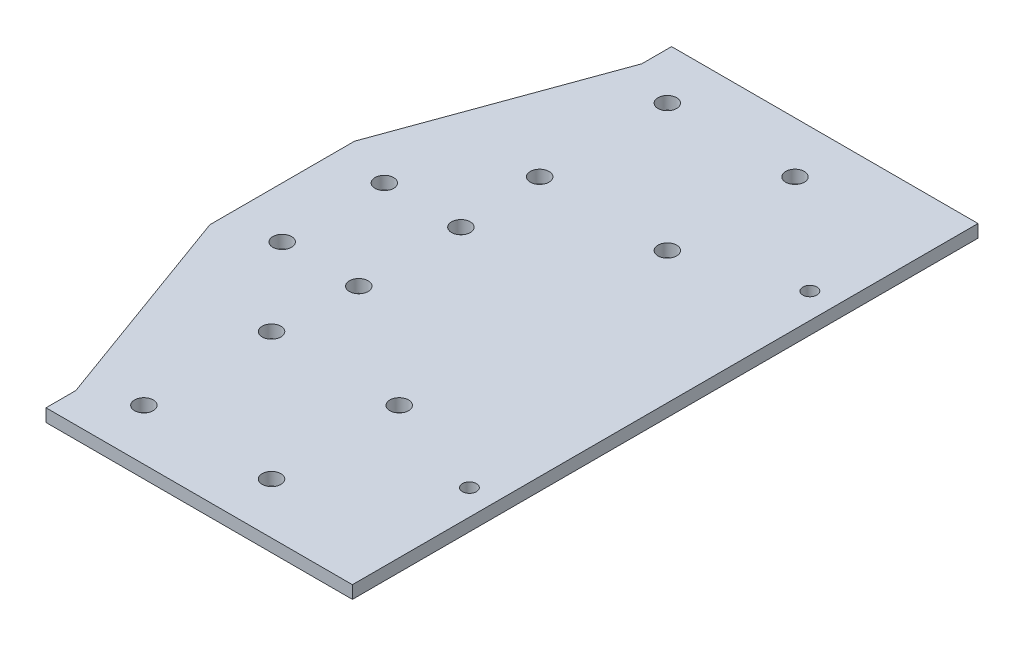
ISO-10303-21;
HEADER;
FILE_DESCRIPTION(('STEP AP214'),'2;1');
FILE_NAME('part.step','',(''),(''),'','','');
FILE_SCHEMA(('AUTOMOTIVE_DESIGN { 1 0 10303 214 1 1 1 1 }'));
ENDSEC;
DATA;
#1=APPLICATION_CONTEXT('core data for automotive mechanical design processes');
#2=APPLICATION_PROTOCOL_DEFINITION('international standard','automotive_design',2000,#1);
#3=PRODUCT_CONTEXT('',#1,'mechanical');
#4=PRODUCT('Part','Part','',(#3));
#5=PRODUCT_RELATED_PRODUCT_CATEGORY('part','',(#4));
#6=PRODUCT_DEFINITION_FORMATION('','',#4);
#7=PRODUCT_DEFINITION_CONTEXT('part definition',#1,'design');
#8=PRODUCT_DEFINITION('design','',#6,#7);
#9=PRODUCT_DEFINITION_SHAPE('','',#8);
#10=(LENGTH_UNIT() NAMED_UNIT(*) SI_UNIT(.MILLI.,.METRE.));
#11=(NAMED_UNIT(*) PLANE_ANGLE_UNIT() SI_UNIT($,.RADIAN.));
#12=(NAMED_UNIT(*) SI_UNIT($,.STERADIAN.) SOLID_ANGLE_UNIT());
#13=UNCERTAINTY_MEASURE_WITH_UNIT(LENGTH_MEASURE(1.E-05),#10,'distance_accuracy_value','');
#14=(GEOMETRIC_REPRESENTATION_CONTEXT(3) GLOBAL_UNCERTAINTY_ASSIGNED_CONTEXT((#13)) GLOBAL_UNIT_ASSIGNED_CONTEXT((#10,
#11,#12)) REPRESENTATION_CONTEXT('',''));
#15=CARTESIAN_POINT('',(0.,0.,0.));
#16=DIRECTION('',(0.,0.,1.));
#17=DIRECTION('',(1.,0.,0.));
#18=AXIS2_PLACEMENT_3D('',#15,#16,#17);
#19=CARTESIAN_POINT('',(0.,3.,0.));
#20=DIRECTION('',(0.,0.,-1.));
#21=DIRECTION('',(-1.,0.,0.));
#22=AXIS2_PLACEMENT_3D('',#19,#20,#21);
#23=PLANE('',#22);
#24=DIRECTION('',(1.,0.,0.));
#25=VECTOR('',#24,1.);
#26=CARTESIAN_POINT('',(0.,0.,0.));
#27=LINE('',#26,#25);
#28=CARTESIAN_POINT('',(-42.1534711504774,0.,0.));
#29=VERTEX_POINT('',#28);
#30=CARTESIAN_POINT('',(29.8465288495226,0.,0.));
#31=VERTEX_POINT('',#30);
#32=EDGE_CURVE('E89',#29,#31,#27,.T.);
#33=ORIENTED_EDGE('',*,*,#32,.T.);
#34=DIRECTION('',(0.,-1.,0.));
#35=VECTOR('',#34,1.);
#36=CARTESIAN_POINT('',(29.8465288495226,3.,0.));
#37=LINE('',#36,#35);
#38=CARTESIAN_POINT('',(29.8465288495226,3.,0.));
#39=VERTEX_POINT('',#38);
#40=EDGE_CURVE('E11',#39,#31,#37,.T.);
#41=ORIENTED_EDGE('',*,*,#40,.F.);
#42=DIRECTION('',(1.,0.,0.));
#43=VECTOR('',#42,1.);
#44=CARTESIAN_POINT('',(-42.1534711504774,3.,0.));
#45=LINE('',#44,#43);
#46=CARTESIAN_POINT('',(-42.1534711504774,3.,0.));
#47=VERTEX_POINT('',#46);
#48=EDGE_CURVE('E95',#47,#39,#45,.T.);
#49=ORIENTED_EDGE('',*,*,#48,.F.);
#50=DIRECTION('',(0.,-1.,0.));
#51=VECTOR('',#50,1.);
#52=CARTESIAN_POINT('',(-42.1534711504774,3.,0.));
#53=LINE('',#52,#51);
#54=EDGE_CURVE('E129',#47,#29,#53,.T.);
#55=ORIENTED_EDGE('',*,*,#54,.T.);
#56=EDGE_LOOP('',(#33,#41,#49,#55));
#57=FACE_BOUND('',#56,.T.);
#58=ADVANCED_FACE('F35',(#57),#23,.F.);
#59=CARTESIAN_POINT('',(29.8465288495226,3.,0.));
#60=DIRECTION('',(-1.,0.,0.));
#61=DIRECTION('',(0.,0.,1.));
#62=AXIS2_PLACEMENT_3D('',#59,#60,#61);
#63=PLANE('',#62);
#64=DIRECTION('',(0.,0.,-1.));
#65=VECTOR('',#64,1.);
#66=CARTESIAN_POINT('',(29.8465288495226,0.,0.));
#67=LINE('',#66,#65);
#68=CARTESIAN_POINT('',(29.8465288495226,0.,-147.));
#69=VERTEX_POINT('',#68);
#70=EDGE_CURVE('E134',#31,#69,#67,.T.);
#71=ORIENTED_EDGE('',*,*,#70,.T.);
#72=DIRECTION('',(0.,-1.,0.));
#73=VECTOR('',#72,1.);
#74=CARTESIAN_POINT('',(29.8465288495226,3.,-147.));
#75=LINE('',#74,#73);
#76=CARTESIAN_POINT('',(29.8465288495226,3.,-147.));
#77=VERTEX_POINT('',#76);
#78=EDGE_CURVE('E44',#77,#69,#75,.T.);
#79=ORIENTED_EDGE('',*,*,#78,.F.);
#80=DIRECTION('',(0.,0.,-1.));
#81=VECTOR('',#80,1.);
#82=CARTESIAN_POINT('',(29.8465288495226,3.,0.));
#83=LINE('',#82,#81);
#84=EDGE_CURVE('E227',#39,#77,#83,.T.);
#85=ORIENTED_EDGE('',*,*,#84,.F.);
#86=ORIENTED_EDGE('',*,*,#40,.T.);
#87=EDGE_LOOP('',(#71,#79,#85,#86));
#88=FACE_BOUND('',#87,.T.);
#89=ADVANCED_FACE('F218',(#88),#63,.F.);
#90=CARTESIAN_POINT('',(-42.1534711504775,3.,-147.));
#91=DIRECTION('',(0.,0.,1.));
#92=DIRECTION('',(1.,0.,0.));
#93=AXIS2_PLACEMENT_3D('',#90,#91,#92);
#94=PLANE('',#93);
#95=DIRECTION('',(-1.,0.,0.));
#96=VECTOR('',#95,1.);
#97=CARTESIAN_POINT('',(-42.1534711504775,0.,-147.));
#98=LINE('',#97,#96);
#99=CARTESIAN_POINT('',(-42.1534711504775,0.,-147.));
#100=VERTEX_POINT('',#99);
#101=EDGE_CURVE('E137',#69,#100,#98,.T.);
#102=ORIENTED_EDGE('',*,*,#101,.T.);
#103=DIRECTION('',(0.,-1.,0.));
#104=VECTOR('',#103,1.);
#105=CARTESIAN_POINT('',(-42.1534711504775,3.,-147.));
#106=LINE('',#105,#104);
#107=CARTESIAN_POINT('',(-42.1534711504775,3.,-147.));
#108=VERTEX_POINT('',#107);
#109=EDGE_CURVE('E154',#108,#100,#106,.T.);
#110=ORIENTED_EDGE('',*,*,#109,.F.);
#111=DIRECTION('',(-1.,0.,0.));
#112=VECTOR('',#111,1.);
#113=CARTESIAN_POINT('',(0.,3.,-147.));
#114=LINE('',#113,#112);
#115=EDGE_CURVE('E238',#77,#108,#114,.T.);
#116=ORIENTED_EDGE('',*,*,#115,.F.);
#117=ORIENTED_EDGE('',*,*,#78,.T.);
#118=EDGE_LOOP('',(#102,#110,#116,#117));
#119=FACE_BOUND('',#118,.T.);
#120=ADVANCED_FACE('F223',(#119),#94,.F.);
#121=CARTESIAN_POINT('',(-42.1534711504774,3.,-140.));
#122=DIRECTION('',(1.,0.,0.));
#123=DIRECTION('',(0.,0.,-1.));
#124=AXIS2_PLACEMENT_3D('',#121,#122,#123);
#125=PLANE('',#124);
#126=DIRECTION('',(0.,0.,1.));
#127=VECTOR('',#126,1.);
#128=CARTESIAN_POINT('',(-42.1534711504774,0.,-140.));
#129=LINE('',#128,#127);
#130=CARTESIAN_POINT('',(-42.1534711504774,0.,-140.));
#131=VERTEX_POINT('',#130);
#132=EDGE_CURVE('E139',#100,#131,#129,.T.);
#133=ORIENTED_EDGE('',*,*,#132,.T.);
#134=DIRECTION('',(0.,-1.,0.));
#135=VECTOR('',#134,1.);
#136=CARTESIAN_POINT('',(-42.1534711504774,3.,-140.));
#137=LINE('',#136,#135);
#138=CARTESIAN_POINT('',(-42.1534711504774,3.,-140.));
#139=VERTEX_POINT('',#138);
#140=EDGE_CURVE('E151',#139,#131,#137,.T.);
#141=ORIENTED_EDGE('',*,*,#140,.F.);
#142=DIRECTION('',(0.,0.,1.));
#143=VECTOR('',#142,1.);
#144=CARTESIAN_POINT('',(-42.1534711504774,3.,-140.));
#145=LINE('',#144,#143);
#146=EDGE_CURVE('E237',#108,#139,#145,.T.);
#147=ORIENTED_EDGE('',*,*,#146,.F.);
#148=ORIENTED_EDGE('',*,*,#109,.T.);
#149=EDGE_LOOP('',(#133,#141,#147,#148));
#150=FACE_BOUND('',#149,.T.);
#151=ADVANCED_FACE('F235',(#150),#125,.F.);
#152=CARTESIAN_POINT('',(-60.1534711504774,3.,-90.5));
#153=DIRECTION('',(0.939793423488437,0.,0.341743063086704));
#154=DIRECTION('',(0.341743063086705,0.,-0.939793423488437));
#155=AXIS2_PLACEMENT_3D('',#152,#153,#154);
#156=PLANE('',#155);
#157=DIRECTION('',(-0.341743063086705,0.,0.939793423488437));
#158=VECTOR('',#157,1.);
#159=CARTESIAN_POINT('',(-60.1534711504774,0.,-90.5));
#160=LINE('',#159,#158);
#161=CARTESIAN_POINT('',(-60.1534711504774,0.,-90.5));
#162=VERTEX_POINT('',#161);
#163=EDGE_CURVE('E141',#131,#162,#160,.T.);
#164=ORIENTED_EDGE('',*,*,#163,.T.);
#165=DIRECTION('',(0.,-1.,0.));
#166=VECTOR('',#165,1.);
#167=CARTESIAN_POINT('',(-60.1534711504774,3.,-90.5));
#168=LINE('',#167,#166);
#169=CARTESIAN_POINT('',(-60.1534711504774,3.,-90.5));
#170=VERTEX_POINT('',#169);
#171=EDGE_CURVE('E124',#170,#162,#168,.T.);
#172=ORIENTED_EDGE('',*,*,#171,.F.);
#173=DIRECTION('',(-0.341743063086705,0.,0.939793423488437));
#174=VECTOR('',#173,1.);
#175=CARTESIAN_POINT('',(-60.1534711504774,3.,-90.5));
#176=LINE('',#175,#174);
#177=EDGE_CURVE('E115',#139,#170,#176,.T.);
#178=ORIENTED_EDGE('',*,*,#177,.F.);
#179=ORIENTED_EDGE('',*,*,#140,.T.);
#180=EDGE_LOOP('',(#164,#172,#178,#179));
#181=FACE_BOUND('',#180,.T.);
#182=ADVANCED_FACE('F322',(#181),#156,.F.);
#183=CARTESIAN_POINT('',(-60.1534711504774,3.,-90.5));
#184=DIRECTION('',(1.,0.,0.));
#185=DIRECTION('',(0.,0.,-1.));
#186=AXIS2_PLACEMENT_3D('',#183,#184,#185);
#187=PLANE('',#186);
#188=DIRECTION('',(0.,0.,1.));
#189=VECTOR('',#188,1.);
#190=CARTESIAN_POINT('',(-60.1534711504774,0.,-90.5));
#191=LINE('',#190,#189);
#192=CARTESIAN_POINT('',(-60.1534711504774,0.,-56.5));
#193=VERTEX_POINT('',#192);
#194=EDGE_CURVE('E123',#162,#193,#191,.T.);
#195=ORIENTED_EDGE('',*,*,#194,.T.);
#196=DIRECTION('',(0.,-1.,0.));
#197=VECTOR('',#196,1.);
#198=CARTESIAN_POINT('',(-60.1534711504774,3.,-56.5));
#199=LINE('',#198,#197);
#200=CARTESIAN_POINT('',(-60.1534711504774,3.,-56.5));
#201=VERTEX_POINT('',#200);
#202=EDGE_CURVE('E120',#201,#193,#199,.T.);
#203=ORIENTED_EDGE('',*,*,#202,.F.);
#204=DIRECTION('',(0.,0.,1.));
#205=VECTOR('',#204,1.);
#206=CARTESIAN_POINT('',(-60.1534711504774,3.,-90.5));
#207=LINE('',#206,#205);
#208=EDGE_CURVE('E109',#170,#201,#207,.T.);
#209=ORIENTED_EDGE('',*,*,#208,.F.);
#210=ORIENTED_EDGE('',*,*,#171,.T.);
#211=EDGE_LOOP('',(#195,#203,#209,#210));
#212=FACE_BOUND('',#211,.T.);
#213=ADVANCED_FACE('F121',(#212),#187,.F.);
#214=CARTESIAN_POINT('',(-60.1534711504774,3.,-56.5));
#215=DIRECTION('',(0.939793423488437,0.,-0.341743063086705));
#216=DIRECTION('',(-0.341743063086705,0.,-0.939793423488437));
#217=AXIS2_PLACEMENT_3D('',#214,#215,#216);
#218=PLANE('',#217);
#219=DIRECTION('',(0.341743063086705,0.,0.939793423488437));
#220=VECTOR('',#219,1.);
#221=CARTESIAN_POINT('',(-60.1534711504774,0.,-56.5));
#222=LINE('',#221,#220);
#223=CARTESIAN_POINT('',(-42.1534711504774,0.,-7.));
#224=VERTEX_POINT('',#223);
#225=EDGE_CURVE('E82',#193,#224,#222,.T.);
#226=ORIENTED_EDGE('',*,*,#225,.T.);
#227=DIRECTION('',(0.,-1.,0.));
#228=VECTOR('',#227,1.);
#229=CARTESIAN_POINT('',(-42.1534711504774,3.,-7.));
#230=LINE('',#229,#228);
#231=CARTESIAN_POINT('',(-42.1534711504774,3.,-7.));
#232=VERTEX_POINT('',#231);
#233=EDGE_CURVE('E125',#232,#224,#230,.T.);
#234=ORIENTED_EDGE('',*,*,#233,.F.);
#235=DIRECTION('',(0.341743063086705,0.,0.939793423488437));
#236=VECTOR('',#235,1.);
#237=CARTESIAN_POINT('',(-60.1534711504774,3.,-56.5));
#238=LINE('',#237,#236);
#239=EDGE_CURVE('E113',#201,#232,#238,.T.);
#240=ORIENTED_EDGE('',*,*,#239,.F.);
#241=ORIENTED_EDGE('',*,*,#202,.T.);
#242=EDGE_LOOP('',(#226,#234,#240,#241));
#243=FACE_BOUND('',#242,.T.);
#244=ADVANCED_FACE('F127',(#243),#218,.F.);
#245=CARTESIAN_POINT('',(-42.1534711504774,3.,-7.));
#246=DIRECTION('',(1.,0.,0.));
#247=DIRECTION('',(0.,0.,-1.));
#248=AXIS2_PLACEMENT_3D('',#245,#246,#247);
#249=PLANE('',#248);
#250=DIRECTION('',(0.,0.,1.));
#251=VECTOR('',#250,1.);
#252=CARTESIAN_POINT('',(-42.1534711504774,0.,-7.));
#253=LINE('',#252,#251);
#254=EDGE_CURVE('E145',#224,#29,#253,.T.);
#255=ORIENTED_EDGE('',*,*,#254,.T.);
#256=ORIENTED_EDGE('',*,*,#54,.F.);
#257=DIRECTION('',(0.,0.,1.));
#258=VECTOR('',#257,1.);
#259=CARTESIAN_POINT('',(-42.1534711504774,3.,-7.));
#260=LINE('',#259,#258);
#261=EDGE_CURVE('E53',#232,#47,#260,.T.);
#262=ORIENTED_EDGE('',*,*,#261,.F.);
#263=ORIENTED_EDGE('',*,*,#233,.T.);
#264=EDGE_LOOP('',(#255,#256,#262,#263));
#265=FACE_BOUND('',#264,.T.);
#266=ADVANCED_FACE('F290',(#265),#249,.F.);
#267=CARTESIAN_POINT('',(0.,3.,0.));
#268=DIRECTION('',(0.,1.,0.));
#269=DIRECTION('',(0.,0.,1.));
#270=AXIS2_PLACEMENT_3D('',#267,#268,#269);
#271=PLANE('',#270);
#272=CARTESIAN_POINT('',(-1.15347115047745,3.,-105.));
#273=DIRECTION('',(0.,1.,0.));
#274=DIRECTION('',(0.,0.,1.));
#275=AXIS2_PLACEMENT_3D('',#272,#273,#274);
#276=CIRCLE('',#275,2.19999999999998);
#277=CARTESIAN_POINT('',(-1.15347115047745,3.,-102.8));
#278=VERTEX_POINT('',#277);
#279=EDGE_CURVE('E251',#278,#278,#276,.T.);
#280=ORIENTED_EDGE('',*,*,#279,.F.);
#281=EDGE_LOOP('',(#280));
#282=FACE_BOUND('',#281,.T.);
#283=CARTESIAN_POINT('',(-31.1534711504774,3.,-135.));
#284=DIRECTION('',(0.,1.,0.));
#285=DIRECTION('',(0.,0.,-1.));
#286=AXIS2_PLACEMENT_3D('',#283,#284,#285);
#287=CIRCLE('',#286,2.20000000000002);
#288=CARTESIAN_POINT('',(-31.1534711504774,3.,-137.2));
#289=VERTEX_POINT('',#288);
#290=EDGE_CURVE('E259',#289,#289,#287,.T.);
#291=ORIENTED_EDGE('',*,*,#290,.F.);
#292=EDGE_LOOP('',(#291));
#293=FACE_BOUND('',#292,.T.);
#294=CARTESIAN_POINT('',(-31.1534711504774,3.,-105.));
#295=DIRECTION('',(0.,1.,0.));
#296=DIRECTION('',(0.,0.,-1.));
#297=AXIS2_PLACEMENT_3D('',#294,#295,#296);
#298=CIRCLE('',#297,2.20000000000002);
#299=CARTESIAN_POINT('',(-31.1534711504774,3.,-107.2));
#300=VERTEX_POINT('',#299);
#301=EDGE_CURVE('E262',#300,#300,#298,.T.);
#302=ORIENTED_EDGE('',*,*,#301,.F.);
#303=EDGE_LOOP('',(#302));
#304=FACE_BOUND('',#303,.T.);
#305=CARTESIAN_POINT('',(-31.1534711504774,3.,-42.));
#306=DIRECTION('',(0.,1.,0.));
#307=DIRECTION('',(0.,0.,1.));
#308=AXIS2_PLACEMENT_3D('',#305,#306,#307);
#309=CIRCLE('',#308,2.2);
#310=CARTESIAN_POINT('',(-31.1534711504774,3.,-39.8));
#311=VERTEX_POINT('',#310);
#312=EDGE_CURVE('E264',#311,#311,#309,.T.);
#313=ORIENTED_EDGE('',*,*,#312,.F.);
#314=EDGE_LOOP('',(#313));
#315=FACE_BOUND('',#314,.T.);
#316=CARTESIAN_POINT('',(-48.1534711504774,3.,-61.5));
#317=DIRECTION('',(0.,1.,0.));
#318=DIRECTION('',(0.,0.,-1.));
#319=AXIS2_PLACEMENT_3D('',#316,#317,#318);
#320=CIRCLE('',#319,2.19999999999998);
#321=CARTESIAN_POINT('',(-48.1534711504774,3.,-63.7));
#322=VERTEX_POINT('',#321);
#323=EDGE_CURVE('E247',#322,#322,#320,.T.);
#324=ORIENTED_EDGE('',*,*,#323,.F.);
#325=EDGE_LOOP('',(#324));
#326=FACE_BOUND('',#325,.T.);
#327=CARTESIAN_POINT('',(-30.1534711504774,3.,-61.5));
#328=DIRECTION('',(0.,1.,0.));
#329=DIRECTION('',(0.,0.,-1.));
#330=AXIS2_PLACEMENT_3D('',#327,#328,#329);
#331=CIRCLE('',#330,2.2);
#332=CARTESIAN_POINT('',(-30.1534711504774,3.,-63.7));
#333=VERTEX_POINT('',#332);
#334=EDGE_CURVE('E250',#333,#333,#331,.T.);
#335=ORIENTED_EDGE('',*,*,#334,.F.);
#336=EDGE_LOOP('',(#335));
#337=FACE_BOUND('',#336,.T.);
#338=CARTESIAN_POINT('',(-1.15347115047745,3.,-135.));
#339=DIRECTION('',(0.,1.,0.));
#340=DIRECTION('',(0.,0.,1.));
#341=AXIS2_PLACEMENT_3D('',#338,#339,#340);
#342=CIRCLE('',#341,2.2);
#343=CARTESIAN_POINT('',(-1.15347115047745,3.,-132.8));
#344=VERTEX_POINT('',#343);
#345=EDGE_CURVE('E254',#344,#344,#342,.T.);
#346=ORIENTED_EDGE('',*,*,#345,.F.);
#347=EDGE_LOOP('',(#346));
#348=FACE_BOUND('',#347,.T.);
#349=CARTESIAN_POINT('',(-30.1534711504774,3.,-85.5));
#350=DIRECTION('',(0.,1.,0.));
#351=DIRECTION('',(0.,0.,1.));
#352=AXIS2_PLACEMENT_3D('',#349,#350,#351);
#353=CIRCLE('',#352,2.2);
#354=CARTESIAN_POINT('',(-30.1534711504774,3.,-83.3));
#355=VERTEX_POINT('',#354);
#356=EDGE_CURVE('E246',#355,#355,#353,.T.);
#357=ORIENTED_EDGE('',*,*,#356,.F.);
#358=EDGE_LOOP('',(#357));
#359=FACE_BOUND('',#358,.T.);
#360=CARTESIAN_POINT('',(23.8465288495226,3.,-33.5));
#361=DIRECTION('',(0.,1.,0.));
#362=DIRECTION('',(0.,0.,-1.));
#363=AXIS2_PLACEMENT_3D('',#360,#361,#362);
#364=CIRCLE('',#363,1.65);
#365=CARTESIAN_POINT('',(23.8465288495226,3.,-35.15));
#366=VERTEX_POINT('',#365);
#367=EDGE_CURVE('E279',#366,#366,#364,.T.);
#368=ORIENTED_EDGE('',*,*,#367,.F.);
#369=EDGE_LOOP('',(#368));
#370=FACE_BOUND('',#369,.T.);
#371=CARTESIAN_POINT('',(-31.1534711504774,3.,-12.));
#372=DIRECTION('',(0.,1.,0.));
#373=DIRECTION('',(0.,0.,1.));
#374=AXIS2_PLACEMENT_3D('',#371,#372,#373);
#375=CIRCLE('',#374,2.2);
#376=CARTESIAN_POINT('',(-31.1534711504774,3.,-9.79999999999995));
#377=VERTEX_POINT('',#376);
#378=EDGE_CURVE('E267',#377,#377,#375,.T.);
#379=ORIENTED_EDGE('',*,*,#378,.F.);
#380=EDGE_LOOP('',(#379));
#381=FACE_BOUND('',#380,.T.);
#382=CARTESIAN_POINT('',(-1.15347115047745,3.,-42.));
#383=DIRECTION('',(0.,1.,0.));
#384=DIRECTION('',(0.,0.,-1.));
#385=AXIS2_PLACEMENT_3D('',#382,#383,#384);
#386=CIRCLE('',#385,2.2);
#387=CARTESIAN_POINT('',(-1.15347115047745,3.,-44.2));
#388=VERTEX_POINT('',#387);
#389=EDGE_CURVE('E270',#388,#388,#386,.T.);
#390=ORIENTED_EDGE('',*,*,#389,.F.);
#391=EDGE_LOOP('',(#390));
#392=FACE_BOUND('',#391,.T.);
#393=CARTESIAN_POINT('',(-1.15347115047745,3.,-12.));
#394=DIRECTION('',(0.,1.,0.));
#395=DIRECTION('',(0.,0.,-1.));
#396=AXIS2_PLACEMENT_3D('',#393,#394,#395);
#397=CIRCLE('',#396,2.2);
#398=CARTESIAN_POINT('',(-1.15347115047745,3.,-14.2));
#399=VERTEX_POINT('',#398);
#400=EDGE_CURVE('E273',#399,#399,#397,.T.);
#401=ORIENTED_EDGE('',*,*,#400,.F.);
#402=EDGE_LOOP('',(#401));
#403=FACE_BOUND('',#402,.T.);
#404=CARTESIAN_POINT('',(23.8465288495226,3.,-113.5));
#405=DIRECTION('',(0.,1.,0.));
#406=DIRECTION('',(0.,0.,1.));
#407=AXIS2_PLACEMENT_3D('',#404,#405,#406);
#408=CIRCLE('',#407,1.65);
#409=CARTESIAN_POINT('',(23.8465288495226,3.,-111.85));
#410=VERTEX_POINT('',#409);
#411=EDGE_CURVE('E276',#410,#410,#408,.T.);
#412=ORIENTED_EDGE('',*,*,#411,.F.);
#413=EDGE_LOOP('',(#412));
#414=FACE_BOUND('',#413,.T.);
#415=CARTESIAN_POINT('',(-48.1534711504774,3.,-85.5));
#416=DIRECTION('',(0.,1.,0.));
#417=DIRECTION('',(0.,0.,1.));
#418=AXIS2_PLACEMENT_3D('',#415,#416,#417);
#419=CIRCLE('',#418,2.19999999999998);
#420=CARTESIAN_POINT('',(-48.1534711504774,3.,-83.3));
#421=VERTEX_POINT('',#420);
#422=EDGE_CURVE('E163',#421,#421,#419,.T.);
#423=ORIENTED_EDGE('',*,*,#422,.F.);
#424=EDGE_LOOP('',(#423));
#425=FACE_BOUND('',#424,.T.);
#426=ORIENTED_EDGE('',*,*,#48,.T.);
#427=ORIENTED_EDGE('',*,*,#84,.T.);
#428=ORIENTED_EDGE('',*,*,#115,.T.);
#429=ORIENTED_EDGE('',*,*,#146,.T.);
#430=ORIENTED_EDGE('',*,*,#177,.T.);
#431=ORIENTED_EDGE('',*,*,#208,.T.);
#432=ORIENTED_EDGE('',*,*,#239,.T.);
#433=ORIENTED_EDGE('',*,*,#261,.T.);
#434=EDGE_LOOP('',(#426,#427,#428,#429,#430,#431,#432,#433));
#435=FACE_BOUND('',#434,.T.);
#436=ADVANCED_FACE('F111',(#282,#293,#304,#315,#326,#337,#348,#359,#370,#381,#392,#403,#414,
#425,#435),#271,.T.);
#437=CARTESIAN_POINT('',(0.,0.,0.));
#438=DIRECTION('',(0.,1.,0.));
#439=DIRECTION('',(0.,0.,1.));
#440=AXIS2_PLACEMENT_3D('',#437,#438,#439);
#441=PLANE('',#440);
#442=CARTESIAN_POINT('',(-1.15347115047745,0.,-105.));
#443=DIRECTION('',(0.,1.,0.));
#444=DIRECTION('',(0.,0.,1.));
#445=AXIS2_PLACEMENT_3D('',#442,#443,#444);
#446=CIRCLE('',#445,2.19999999999998);
#447=CARTESIAN_POINT('',(-1.15347115047745,0.,-102.8));
#448=VERTEX_POINT('',#447);
#449=EDGE_CURVE('E38',#448,#448,#446,.T.);
#450=ORIENTED_EDGE('',*,*,#449,.T.);
#451=EDGE_LOOP('',(#450));
#452=FACE_BOUND('',#451,.T.);
#453=CARTESIAN_POINT('',(-31.1534711504774,0.,-135.));
#454=DIRECTION('',(0.,1.,0.));
#455=DIRECTION('',(0.,0.,1.));
#456=AXIS2_PLACEMENT_3D('',#453,#454,#455);
#457=CIRCLE('',#456,2.20000000000002);
#458=CARTESIAN_POINT('',(-31.1534711504774,0.,-132.8));
#459=VERTEX_POINT('',#458);
#460=EDGE_CURVE('E195',#459,#459,#457,.T.);
#461=ORIENTED_EDGE('',*,*,#460,.T.);
#462=EDGE_LOOP('',(#461));
#463=FACE_BOUND('',#462,.T.);
#464=CARTESIAN_POINT('',(-31.1534711504774,0.,-105.));
#465=DIRECTION('',(0.,1.,0.));
#466=DIRECTION('',(0.,0.,1.));
#467=AXIS2_PLACEMENT_3D('',#464,#465,#466);
#468=CIRCLE('',#467,2.20000000000002);
#469=CARTESIAN_POINT('',(-31.1534711504774,0.,-102.8));
#470=VERTEX_POINT('',#469);
#471=EDGE_CURVE('E193',#470,#470,#468,.T.);
#472=ORIENTED_EDGE('',*,*,#471,.T.);
#473=EDGE_LOOP('',(#472));
#474=FACE_BOUND('',#473,.T.);
#475=CARTESIAN_POINT('',(-31.1534711504774,0.,-42.));
#476=DIRECTION('',(0.,1.,0.));
#477=DIRECTION('',(0.,0.,1.));
#478=AXIS2_PLACEMENT_3D('',#475,#476,#477);
#479=CIRCLE('',#478,2.2);
#480=CARTESIAN_POINT('',(-31.1534711504774,0.,-39.8));
#481=VERTEX_POINT('',#480);
#482=EDGE_CURVE('E190',#481,#481,#479,.T.);
#483=ORIENTED_EDGE('',*,*,#482,.T.);
#484=EDGE_LOOP('',(#483));
#485=FACE_BOUND('',#484,.T.);
#486=CARTESIAN_POINT('',(-48.1534711504774,0.,-61.5));
#487=DIRECTION('',(0.,1.,0.));
#488=DIRECTION('',(0.,0.,1.));
#489=AXIS2_PLACEMENT_3D('',#486,#487,#488);
#490=CIRCLE('',#489,2.19999999999998);
#491=CARTESIAN_POINT('',(-48.1534711504774,0.,-59.3));
#492=VERTEX_POINT('',#491);
#493=EDGE_CURVE('E187',#492,#492,#490,.T.);
#494=ORIENTED_EDGE('',*,*,#493,.T.);
#495=EDGE_LOOP('',(#494));
#496=FACE_BOUND('',#495,.T.);
#497=CARTESIAN_POINT('',(-30.1534711504774,0.,-61.5));
#498=DIRECTION('',(0.,1.,0.));
#499=DIRECTION('',(0.,0.,1.));
#500=AXIS2_PLACEMENT_3D('',#497,#498,#499);
#501=CIRCLE('',#500,2.2);
#502=CARTESIAN_POINT('',(-30.1534711504774,0.,-59.3));
#503=VERTEX_POINT('',#502);
#504=EDGE_CURVE('E184',#503,#503,#501,.T.);
#505=ORIENTED_EDGE('',*,*,#504,.T.);
#506=EDGE_LOOP('',(#505));
#507=FACE_BOUND('',#506,.T.);
#508=CARTESIAN_POINT('',(-1.15347115047745,0.,-135.));
#509=DIRECTION('',(0.,1.,0.));
#510=DIRECTION('',(0.,0.,1.));
#511=AXIS2_PLACEMENT_3D('',#508,#509,#510);
#512=CIRCLE('',#511,2.2);
#513=CARTESIAN_POINT('',(-1.15347115047745,0.,-132.8));
#514=VERTEX_POINT('',#513);
#515=EDGE_CURVE('E181',#514,#514,#512,.T.);
#516=ORIENTED_EDGE('',*,*,#515,.T.);
#517=EDGE_LOOP('',(#516));
#518=FACE_BOUND('',#517,.T.);
#519=CARTESIAN_POINT('',(-30.1534711504774,0.,-85.5));
#520=DIRECTION('',(0.,1.,0.));
#521=DIRECTION('',(0.,0.,1.));
#522=AXIS2_PLACEMENT_3D('',#519,#520,#521);
#523=CIRCLE('',#522,2.2);
#524=CARTESIAN_POINT('',(-30.1534711504774,0.,-83.3));
#525=VERTEX_POINT('',#524);
#526=EDGE_CURVE('E178',#525,#525,#523,.T.);
#527=ORIENTED_EDGE('',*,*,#526,.T.);
#528=EDGE_LOOP('',(#527));
#529=FACE_BOUND('',#528,.T.);
#530=CARTESIAN_POINT('',(23.8465288495226,0.,-33.5));
#531=DIRECTION('',(0.,1.,0.));
#532=DIRECTION('',(0.,0.,1.));
#533=AXIS2_PLACEMENT_3D('',#530,#531,#532);
#534=CIRCLE('',#533,1.65);
#535=CARTESIAN_POINT('',(23.8465288495226,0.,-31.85));
#536=VERTEX_POINT('',#535);
#537=EDGE_CURVE('E175',#536,#536,#534,.T.);
#538=ORIENTED_EDGE('',*,*,#537,.T.);
#539=EDGE_LOOP('',(#538));
#540=FACE_BOUND('',#539,.T.);
#541=CARTESIAN_POINT('',(-31.1534711504774,0.,-12.));
#542=DIRECTION('',(0.,1.,0.));
#543=DIRECTION('',(0.,0.,1.));
#544=AXIS2_PLACEMENT_3D('',#541,#542,#543);
#545=CIRCLE('',#544,2.2);
#546=CARTESIAN_POINT('',(-31.1534711504774,0.,-9.79999999999995));
#547=VERTEX_POINT('',#546);
#548=EDGE_CURVE('E172',#547,#547,#545,.T.);
#549=ORIENTED_EDGE('',*,*,#548,.T.);
#550=EDGE_LOOP('',(#549));
#551=FACE_BOUND('',#550,.T.);
#552=CARTESIAN_POINT('',(-1.15347115047745,0.,-42.));
#553=DIRECTION('',(0.,1.,0.));
#554=DIRECTION('',(0.,0.,1.));
#555=AXIS2_PLACEMENT_3D('',#552,#553,#554);
#556=CIRCLE('',#555,2.2);
#557=CARTESIAN_POINT('',(-1.15347115047745,0.,-39.8));
#558=VERTEX_POINT('',#557);
#559=EDGE_CURVE('E169',#558,#558,#556,.T.);
#560=ORIENTED_EDGE('',*,*,#559,.T.);
#561=EDGE_LOOP('',(#560));
#562=FACE_BOUND('',#561,.T.);
#563=CARTESIAN_POINT('',(-1.15347115047745,0.,-12.));
#564=DIRECTION('',(0.,1.,0.));
#565=DIRECTION('',(0.,0.,1.));
#566=AXIS2_PLACEMENT_3D('',#563,#564,#565);
#567=CIRCLE('',#566,2.2);
#568=CARTESIAN_POINT('',(-1.15347115047745,0.,-9.79999999999998));
#569=VERTEX_POINT('',#568);
#570=EDGE_CURVE('E166',#569,#569,#567,.T.);
#571=ORIENTED_EDGE('',*,*,#570,.T.);
#572=EDGE_LOOP('',(#571));
#573=FACE_BOUND('',#572,.T.);
#574=CARTESIAN_POINT('',(23.8465288495226,0.,-113.5));
#575=DIRECTION('',(0.,1.,0.));
#576=DIRECTION('',(0.,0.,1.));
#577=AXIS2_PLACEMENT_3D('',#574,#575,#576);
#578=CIRCLE('',#577,1.65);
#579=CARTESIAN_POINT('',(23.8465288495226,0.,-111.85));
#580=VERTEX_POINT('',#579);
#581=EDGE_CURVE('E162',#580,#580,#578,.T.);
#582=ORIENTED_EDGE('',*,*,#581,.T.);
#583=EDGE_LOOP('',(#582));
#584=FACE_BOUND('',#583,.T.);
#585=CARTESIAN_POINT('',(-48.1534711504774,0.,-85.5));
#586=DIRECTION('',(0.,1.,0.));
#587=DIRECTION('',(0.,0.,1.));
#588=AXIS2_PLACEMENT_3D('',#585,#586,#587);
#589=CIRCLE('',#588,2.19999999999998);
#590=CARTESIAN_POINT('',(-48.1534711504774,0.,-83.3));
#591=VERTEX_POINT('',#590);
#592=EDGE_CURVE('E159',#591,#591,#589,.T.);
#593=ORIENTED_EDGE('',*,*,#592,.T.);
#594=EDGE_LOOP('',(#593));
#595=FACE_BOUND('',#594,.T.);
#596=ORIENTED_EDGE('',*,*,#32,.F.);
#597=ORIENTED_EDGE('',*,*,#254,.F.);
#598=ORIENTED_EDGE('',*,*,#225,.F.);
#599=ORIENTED_EDGE('',*,*,#194,.F.);
#600=ORIENTED_EDGE('',*,*,#163,.F.);
#601=ORIENTED_EDGE('',*,*,#132,.F.);
#602=ORIENTED_EDGE('',*,*,#101,.F.);
#603=ORIENTED_EDGE('',*,*,#70,.F.);
#604=EDGE_LOOP('',(#596,#597,#598,#599,#600,#601,#602,#603));
#605=FACE_BOUND('',#604,.T.);
#606=ADVANCED_FACE('F202',(#452,#463,#474,#485,#496,#507,#518,#529,#540,#551,#562,#573,#584,
#595,#605),#441,.F.);
#607=CARTESIAN_POINT('',(-48.1534711504774,-7.,-85.5));
#608=DIRECTION('',(0.,1.,0.));
#609=DIRECTION('',(0.,0.,1.));
#610=AXIS2_PLACEMENT_3D('',#607,#608,#609);
#611=CYLINDRICAL_SURFACE('',#610,2.19999999999998);
#612=ORIENTED_EDGE('',*,*,#422,.T.);
#613=EDGE_LOOP('',(#612));
#614=FACE_BOUND('',#613,.T.);
#615=ORIENTED_EDGE('',*,*,#592,.F.);
#616=EDGE_LOOP('',(#615));
#617=FACE_BOUND('',#616,.T.);
#618=ADVANCED_FACE('F303',(#614,#617),#611,.F.);
#619=CARTESIAN_POINT('',(23.8465288495226,-7.,-113.5));
#620=DIRECTION('',(0.,1.,0.));
#621=DIRECTION('',(0.,0.,1.));
#622=AXIS2_PLACEMENT_3D('',#619,#620,#621);
#623=CYLINDRICAL_SURFACE('',#622,1.65);
#624=ORIENTED_EDGE('',*,*,#411,.T.);
#625=EDGE_LOOP('',(#624));
#626=FACE_BOUND('',#625,.T.);
#627=ORIENTED_EDGE('',*,*,#581,.F.);
#628=EDGE_LOOP('',(#627));
#629=FACE_BOUND('',#628,.T.);
#630=ADVANCED_FACE('F306',(#626,#629),#623,.F.);
#631=CARTESIAN_POINT('',(-1.15347115047745,-7.,-12.));
#632=DIRECTION('',(0.,1.,0.));
#633=DIRECTION('',(0.,0.,1.));
#634=AXIS2_PLACEMENT_3D('',#631,#632,#633);
#635=CYLINDRICAL_SURFACE('',#634,2.2);
#636=ORIENTED_EDGE('',*,*,#400,.T.);
#637=EDGE_LOOP('',(#636));
#638=FACE_BOUND('',#637,.T.);
#639=ORIENTED_EDGE('',*,*,#570,.F.);
#640=EDGE_LOOP('',(#639));
#641=FACE_BOUND('',#640,.T.);
#642=ADVANCED_FACE('F376',(#638,#641),#635,.F.);
#643=CARTESIAN_POINT('',(-1.15347115047745,-7.,-42.));
#644=DIRECTION('',(0.,1.,0.));
#645=DIRECTION('',(0.,0.,1.));
#646=AXIS2_PLACEMENT_3D('',#643,#644,#645);
#647=CYLINDRICAL_SURFACE('',#646,2.2);
#648=ORIENTED_EDGE('',*,*,#389,.T.);
#649=EDGE_LOOP('',(#648));
#650=FACE_BOUND('',#649,.T.);
#651=ORIENTED_EDGE('',*,*,#559,.F.);
#652=EDGE_LOOP('',(#651));
#653=FACE_BOUND('',#652,.T.);
#654=ADVANCED_FACE('F386',(#650,#653),#647,.F.);
#655=CARTESIAN_POINT('',(-31.1534711504774,-7.,-12.));
#656=DIRECTION('',(0.,1.,0.));
#657=DIRECTION('',(0.,0.,1.));
#658=AXIS2_PLACEMENT_3D('',#655,#656,#657);
#659=CYLINDRICAL_SURFACE('',#658,2.2);
#660=ORIENTED_EDGE('',*,*,#378,.T.);
#661=EDGE_LOOP('',(#660));
#662=FACE_BOUND('',#661,.T.);
#663=ORIENTED_EDGE('',*,*,#548,.F.);
#664=EDGE_LOOP('',(#663));
#665=FACE_BOUND('',#664,.T.);
#666=ADVANCED_FACE('F396',(#662,#665),#659,.F.);
#667=CARTESIAN_POINT('',(23.8465288495226,-7.,-33.5));
#668=DIRECTION('',(0.,1.,0.));
#669=DIRECTION('',(0.,0.,1.));
#670=AXIS2_PLACEMENT_3D('',#667,#668,#669);
#671=CYLINDRICAL_SURFACE('',#670,1.65);
#672=ORIENTED_EDGE('',*,*,#367,.T.);
#673=EDGE_LOOP('',(#672));
#674=FACE_BOUND('',#673,.T.);
#675=ORIENTED_EDGE('',*,*,#537,.F.);
#676=EDGE_LOOP('',(#675));
#677=FACE_BOUND('',#676,.T.);
#678=ADVANCED_FACE('F285',(#674,#677),#671,.F.);
#679=CARTESIAN_POINT('',(-30.1534711504774,-7.,-85.5));
#680=DIRECTION('',(0.,1.,0.));
#681=DIRECTION('',(0.,0.,1.));
#682=AXIS2_PLACEMENT_3D('',#679,#680,#681);
#683=CYLINDRICAL_SURFACE('',#682,2.2);
#684=ORIENTED_EDGE('',*,*,#356,.T.);
#685=EDGE_LOOP('',(#684));
#686=FACE_BOUND('',#685,.T.);
#687=ORIENTED_EDGE('',*,*,#526,.F.);
#688=EDGE_LOOP('',(#687));
#689=FACE_BOUND('',#688,.T.);
#690=ADVANCED_FACE('F415',(#686,#689),#683,.F.);
#691=CARTESIAN_POINT('',(-1.15347115047745,-7.,-135.));
#692=DIRECTION('',(0.,1.,0.));
#693=DIRECTION('',(0.,0.,1.));
#694=AXIS2_PLACEMENT_3D('',#691,#692,#693);
#695=CYLINDRICAL_SURFACE('',#694,2.2);
#696=ORIENTED_EDGE('',*,*,#345,.T.);
#697=EDGE_LOOP('',(#696));
#698=FACE_BOUND('',#697,.T.);
#699=ORIENTED_EDGE('',*,*,#515,.F.);
#700=EDGE_LOOP('',(#699));
#701=FACE_BOUND('',#700,.T.);
#702=ADVANCED_FACE('F424',(#698,#701),#695,.F.);
#703=CARTESIAN_POINT('',(-30.1534711504774,-7.,-61.5));
#704=DIRECTION('',(0.,1.,0.));
#705=DIRECTION('',(0.,0.,1.));
#706=AXIS2_PLACEMENT_3D('',#703,#704,#705);
#707=CYLINDRICAL_SURFACE('',#706,2.2);
#708=ORIENTED_EDGE('',*,*,#334,.T.);
#709=EDGE_LOOP('',(#708));
#710=FACE_BOUND('',#709,.T.);
#711=ORIENTED_EDGE('',*,*,#504,.F.);
#712=EDGE_LOOP('',(#711));
#713=FACE_BOUND('',#712,.T.);
#714=ADVANCED_FACE('F434',(#710,#713),#707,.F.);
#715=CARTESIAN_POINT('',(-48.1534711504774,-7.,-61.5));
#716=DIRECTION('',(0.,1.,0.));
#717=DIRECTION('',(0.,0.,1.));
#718=AXIS2_PLACEMENT_3D('',#715,#716,#717);
#719=CYLINDRICAL_SURFACE('',#718,2.19999999999998);
#720=ORIENTED_EDGE('',*,*,#323,.T.);
#721=EDGE_LOOP('',(#720));
#722=FACE_BOUND('',#721,.T.);
#723=ORIENTED_EDGE('',*,*,#493,.F.);
#724=EDGE_LOOP('',(#723));
#725=FACE_BOUND('',#724,.T.);
#726=ADVANCED_FACE('F444',(#722,#725),#719,.F.);
#727=CARTESIAN_POINT('',(-31.1534711504774,-7.,-42.));
#728=DIRECTION('',(0.,1.,0.));
#729=DIRECTION('',(0.,0.,1.));
#730=AXIS2_PLACEMENT_3D('',#727,#728,#729);
#731=CYLINDRICAL_SURFACE('',#730,2.2);
#732=ORIENTED_EDGE('',*,*,#312,.T.);
#733=EDGE_LOOP('',(#732));
#734=FACE_BOUND('',#733,.T.);
#735=ORIENTED_EDGE('',*,*,#482,.F.);
#736=EDGE_LOOP('',(#735));
#737=FACE_BOUND('',#736,.T.);
#738=ADVANCED_FACE('F454',(#734,#737),#731,.F.);
#739=CARTESIAN_POINT('',(-31.1534711504774,-7.,-105.));
#740=DIRECTION('',(0.,1.,0.));
#741=DIRECTION('',(0.,0.,1.));
#742=AXIS2_PLACEMENT_3D('',#739,#740,#741);
#743=CYLINDRICAL_SURFACE('',#742,2.20000000000002);
#744=ORIENTED_EDGE('',*,*,#301,.T.);
#745=EDGE_LOOP('',(#744));
#746=FACE_BOUND('',#745,.T.);
#747=ORIENTED_EDGE('',*,*,#471,.F.);
#748=EDGE_LOOP('',(#747));
#749=FACE_BOUND('',#748,.T.);
#750=ADVANCED_FACE('F212',(#746,#749),#743,.F.);
#751=CARTESIAN_POINT('',(-31.1534711504774,-7.,-135.));
#752=DIRECTION('',(0.,1.,0.));
#753=DIRECTION('',(0.,0.,1.));
#754=AXIS2_PLACEMENT_3D('',#751,#752,#753);
#755=CYLINDRICAL_SURFACE('',#754,2.20000000000002);
#756=ORIENTED_EDGE('',*,*,#290,.T.);
#757=EDGE_LOOP('',(#756));
#758=FACE_BOUND('',#757,.T.);
#759=ORIENTED_EDGE('',*,*,#460,.F.);
#760=EDGE_LOOP('',(#759));
#761=FACE_BOUND('',#760,.T.);
#762=ADVANCED_FACE('F206',(#758,#761),#755,.F.);
#763=CARTESIAN_POINT('',(-1.15347115047745,-7.,-105.));
#764=DIRECTION('',(0.,1.,0.));
#765=DIRECTION('',(0.,0.,1.));
#766=AXIS2_PLACEMENT_3D('',#763,#764,#765);
#767=CYLINDRICAL_SURFACE('',#766,2.19999999999998);
#768=ORIENTED_EDGE('',*,*,#279,.T.);
#769=EDGE_LOOP('',(#768));
#770=FACE_BOUND('',#769,.T.);
#771=ORIENTED_EDGE('',*,*,#449,.F.);
#772=EDGE_LOOP('',(#771));
#773=FACE_BOUND('',#772,.T.);
#774=ADVANCED_FACE('F204',(#770,#773),#767,.F.);
#775=CLOSED_SHELL('',(#58,#89,#120,#151,#182,#213,#244,#266,#436,#606,#618,#630,#642,#654,#666,
#678,#690,#702,#714,#726,#738,#750,#762,#774));
#776=MANIFOLD_SOLID_BREP('B2',#775);
#777=ADVANCED_BREP_SHAPE_REPRESENTATION('',(#18,#776),#14);
#778=SHAPE_DEFINITION_REPRESENTATION(#9,#777);
ENDSEC;
END-ISO-10303-21;
